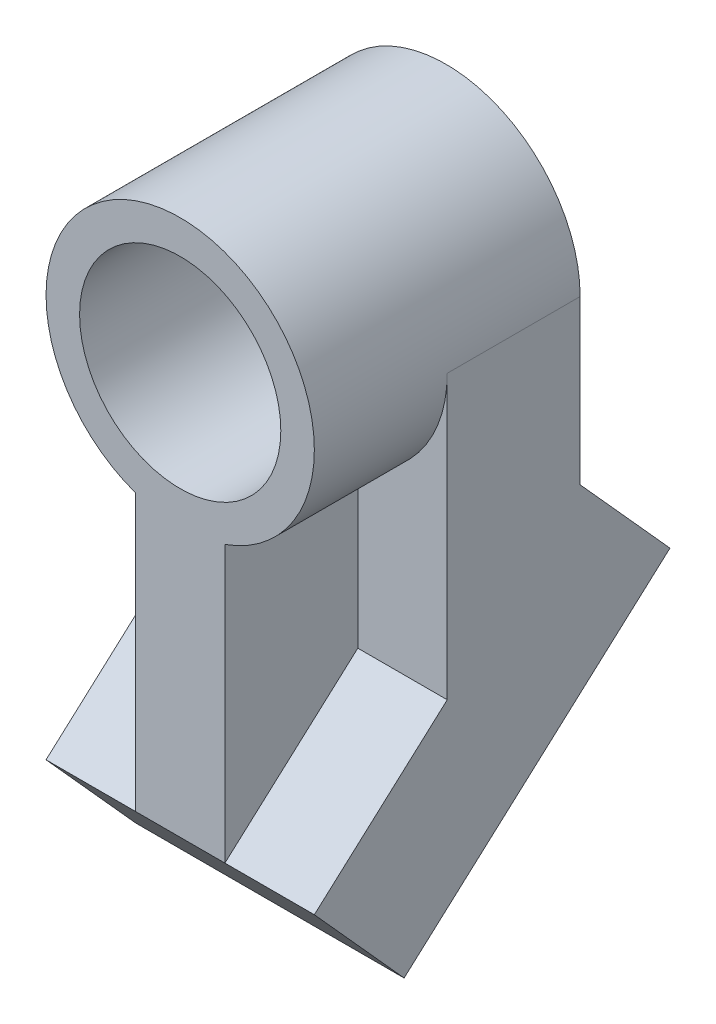
ISO-10303-21;
HEADER;
FILE_DESCRIPTION(('STEP AP214'),'2;1');
FILE_NAME('part.step','',(''),(''),'','','');
FILE_SCHEMA(('AUTOMOTIVE_DESIGN { 1 0 10303 214 1 1 1 1 }'));
ENDSEC;
DATA;
#1=APPLICATION_CONTEXT('core data for automotive mechanical design processes');
#2=APPLICATION_PROTOCOL_DEFINITION('international standard','automotive_design',2000,#1);
#3=PRODUCT_CONTEXT('',#1,'mechanical');
#4=PRODUCT('Part','Part','',(#3));
#5=PRODUCT_RELATED_PRODUCT_CATEGORY('part','',(#4));
#6=PRODUCT_DEFINITION_FORMATION('','',#4);
#7=PRODUCT_DEFINITION_CONTEXT('part definition',#1,'design');
#8=PRODUCT_DEFINITION('design','',#6,#7);
#9=PRODUCT_DEFINITION_SHAPE('','',#8);
#10=(LENGTH_UNIT() NAMED_UNIT(*) SI_UNIT(.MILLI.,.METRE.));
#11=(NAMED_UNIT(*) PLANE_ANGLE_UNIT() SI_UNIT($,.RADIAN.));
#12=(NAMED_UNIT(*) SI_UNIT($,.STERADIAN.) SOLID_ANGLE_UNIT());
#13=UNCERTAINTY_MEASURE_WITH_UNIT(LENGTH_MEASURE(1.E-05),#10,'distance_accuracy_value','');
#14=(GEOMETRIC_REPRESENTATION_CONTEXT(3) GLOBAL_UNCERTAINTY_ASSIGNED_CONTEXT((#13)) GLOBAL_UNIT_ASSIGNED_CONTEXT((#10,
#11,#12)) REPRESENTATION_CONTEXT('',''));
#15=CARTESIAN_POINT('',(0.,0.,0.));
#16=DIRECTION('',(0.,0.,1.));
#17=DIRECTION('',(1.,0.,0.));
#18=AXIS2_PLACEMENT_3D('',#15,#16,#17);
#19=CARTESIAN_POINT('',(-5.,0.,14.86));
#20=DIRECTION('',(-1.,0.,0.));
#21=DIRECTION('',(0.,-1.,0.));
#22=AXIS2_PLACEMENT_3D('',#19,#20,#21);
#23=PLANE('',#22);
#24=DIRECTION('',(0.,1.,0.));
#25=VECTOR('',#24,1.);
#26=CARTESIAN_POINT('',(-5.,0.,0.));
#27=LINE('',#26,#25);
#28=CARTESIAN_POINT('',(-5.,-31.6199959017342,0.));
#29=VERTEX_POINT('',#28);
#30=CARTESIAN_POINT('',(-5.,-14.1421356237309,0.));
#31=VERTEX_POINT('',#30);
#32=EDGE_CURVE('E243',#29,#31,#27,.T.);
#33=ORIENTED_EDGE('',*,*,#32,.F.);
#34=DIRECTION('',(0.,0.669130606358854,-0.743144825477398));
#35=VECTOR('',#34,1.);
#36=CARTESIAN_POINT('',(-4.99999999999999,-45.,14.86));
#37=LINE('',#36,#35);
#38=CARTESIAN_POINT('',(-4.99999999999999,-45.,14.86));
#39=VERTEX_POINT('',#38);
#40=EDGE_CURVE('E196',#39,#29,#37,.T.);
#41=ORIENTED_EDGE('',*,*,#40,.F.);
#42=DIRECTION('',(0.,1.,0.));
#43=VECTOR('',#42,1.);
#44=CARTESIAN_POINT('',(-5.,0.,14.86));
#45=LINE('',#44,#43);
#46=CARTESIAN_POINT('',(-5.,-14.1421356237309,14.86));
#47=VERTEX_POINT('',#46);
#48=EDGE_CURVE('E247',#39,#47,#45,.T.);
#49=ORIENTED_EDGE('',*,*,#48,.T.);
#50=DIRECTION('',(0.,0.,-1.));
#51=VECTOR('',#50,1.);
#52=CARTESIAN_POINT('',(-5.,-14.1421356237309,14.86));
#53=LINE('',#52,#51);
#54=EDGE_CURVE('E253',#47,#31,#53,.T.);
#55=ORIENTED_EDGE('',*,*,#54,.T.);
#56=EDGE_LOOP('',(#33,#41,#49,#55));
#57=FACE_BOUND('',#56,.T.);
#58=ADVANCED_FACE('F39',(#57),#23,.T.);
#59=CARTESIAN_POINT('',(0.,0.,0.));
#60=DIRECTION('',(0.,0.,-1.));
#61=DIRECTION('',(-1.,0.,0.));
#62=AXIS2_PLACEMENT_3D('',#59,#60,#61);
#63=PLANE('',#62);
#64=DIRECTION('',(-1.,0.,0.));
#65=VECTOR('',#64,1.);
#66=CARTESIAN_POINT('',(0.,-31.6199959017342,0.));
#67=LINE('',#66,#65);
#68=CARTESIAN_POINT('',(-15.,-31.6199959017342,0.));
#69=VERTEX_POINT('',#68);
#70=EDGE_CURVE('E217',#29,#69,#67,.T.);
#71=ORIENTED_EDGE('',*,*,#70,.F.);
#72=ORIENTED_EDGE('',*,*,#32,.T.);
#73=CARTESIAN_POINT('',(0.,0.,0.));
#74=DIRECTION('',(0.,0.,1.));
#75=DIRECTION('',(1.,0.,0.));
#76=AXIS2_PLACEMENT_3D('',#73,#74,#75);
#77=CIRCLE('',#76,15.);
#78=CARTESIAN_POINT('',(-15.,0.,0.));
#79=VERTEX_POINT('',#78);
#80=EDGE_CURVE('E255',#79,#31,#77,.T.);
#81=ORIENTED_EDGE('',*,*,#80,.F.);
#82=DIRECTION('',(0.,1.,0.));
#83=VECTOR('',#82,1.);
#84=CARTESIAN_POINT('',(-15.,0.,0.));
#85=LINE('',#84,#83);
#86=EDGE_CURVE('E54',#69,#79,#85,.T.);
#87=ORIENTED_EDGE('',*,*,#86,.F.);
#88=EDGE_LOOP('',(#71,#72,#81,#87));
#89=FACE_BOUND('',#88,.T.);
#90=ADVANCED_FACE('F295',(#89),#63,.F.);
#91=CARTESIAN_POINT('',(0.,0.,-14.86));
#92=DIRECTION('',(0.,0.,-1.));
#93=DIRECTION('',(-1.,0.,0.));
#94=AXIS2_PLACEMENT_3D('',#91,#92,#93);
#95=PLANE('',#94);
#96=DIRECTION('',(0.,-1.,0.));
#97=VECTOR('',#96,1.);
#98=CARTESIAN_POINT('',(15.,0.,-14.86));
#99=LINE('',#98,#97);
#100=CARTESIAN_POINT('',(15.,0.,-14.86));
#101=VERTEX_POINT('',#100);
#102=CARTESIAN_POINT('',(15.,-18.2399918034685,-14.86));
#103=VERTEX_POINT('',#102);
#104=EDGE_CURVE('E224',#101,#103,#99,.T.);
#105=ORIENTED_EDGE('',*,*,#104,.T.);
#106=DIRECTION('',(-1.,0.,0.));
#107=VECTOR('',#106,1.);
#108=CARTESIAN_POINT('',(0.,-18.2399918034685,-14.86));
#109=LINE('',#108,#107);
#110=CARTESIAN_POINT('',(-15.,-18.2399918034685,-14.86));
#111=VERTEX_POINT('',#110);
#112=EDGE_CURVE('E11',#103,#111,#109,.T.);
#113=ORIENTED_EDGE('',*,*,#112,.T.);
#114=DIRECTION('',(0.,1.,0.));
#115=VECTOR('',#114,1.);
#116=CARTESIAN_POINT('',(-15.,0.,-14.86));
#117=LINE('',#116,#115);
#118=CARTESIAN_POINT('',(-15.,0.,-14.86));
#119=VERTEX_POINT('',#118);
#120=EDGE_CURVE('E219',#111,#119,#117,.T.);
#121=ORIENTED_EDGE('',*,*,#120,.T.);
#122=CARTESIAN_POINT('',(0.,0.,-14.86));
#123=DIRECTION('',(0.,0.,-1.));
#124=DIRECTION('',(-1.,0.,0.));
#125=AXIS2_PLACEMENT_3D('',#122,#123,#124);
#126=CIRCLE('',#125,15.);
#127=EDGE_CURVE('E221',#119,#101,#126,.T.);
#128=ORIENTED_EDGE('',*,*,#127,.T.);
#129=EDGE_LOOP('',(#105,#113,#121,#128));
#130=FACE_BOUND('',#129,.T.);
#131=CARTESIAN_POINT('',(0.,0.,-14.86));
#132=DIRECTION('',(0.,0.,-1.));
#133=DIRECTION('',(-1.,0.,0.));
#134=AXIS2_PLACEMENT_3D('',#131,#132,#133);
#135=CIRCLE('',#134,11.25);
#136=CARTESIAN_POINT('',(-11.25,0.,-14.86));
#137=VERTEX_POINT('',#136);
#138=EDGE_CURVE('E227',#137,#137,#135,.F.);
#139=ORIENTED_EDGE('',*,*,#138,.T.);
#140=EDGE_LOOP('',(#139));
#141=FACE_BOUND('',#140,.T.);
#142=ADVANCED_FACE('F278',(#130,#141),#95,.T.);
#143=CARTESIAN_POINT('',(5.,0.,14.86));
#144=DIRECTION('',(-1.,0.,0.));
#145=DIRECTION('',(0.,-1.,0.));
#146=AXIS2_PLACEMENT_3D('',#143,#144,#145);
#147=PLANE('',#146);
#148=DIRECTION('',(0.,1.,0.));
#149=VECTOR('',#148,1.);
#150=CARTESIAN_POINT('',(5.,0.,14.86));
#151=LINE('',#150,#149);
#152=CARTESIAN_POINT('',(5.,-45.,14.86));
#153=VERTEX_POINT('',#152);
#154=CARTESIAN_POINT('',(5.,-14.1421356237309,14.86));
#155=VERTEX_POINT('',#154);
#156=EDGE_CURVE('E242',#153,#155,#151,.T.);
#157=ORIENTED_EDGE('',*,*,#156,.F.);
#158=DIRECTION('',(0.,0.669130606358854,-0.743144825477398));
#159=VECTOR('',#158,1.);
#160=CARTESIAN_POINT('',(5.00000000000001,-24.8518904235224,-7.51674264578613));
#161=LINE('',#160,#159);
#162=CARTESIAN_POINT('',(5.,-31.6199959017342,0.));
#163=VERTEX_POINT('',#162);
#164=EDGE_CURVE('E193',#153,#163,#161,.T.);
#165=ORIENTED_EDGE('',*,*,#164,.T.);
#166=DIRECTION('',(0.,1.,0.));
#167=VECTOR('',#166,1.);
#168=CARTESIAN_POINT('',(5.,0.,0.));
#169=LINE('',#168,#167);
#170=CARTESIAN_POINT('',(5.,-14.1421356237309,0.));
#171=VERTEX_POINT('',#170);
#172=EDGE_CURVE('E238',#163,#171,#169,.T.);
#173=ORIENTED_EDGE('',*,*,#172,.T.);
#174=DIRECTION('',(0.,0.,-1.));
#175=VECTOR('',#174,1.);
#176=CARTESIAN_POINT('',(5.,-14.1421356237309,14.86));
#177=LINE('',#176,#175);
#178=EDGE_CURVE('E47',#155,#171,#177,.T.);
#179=ORIENTED_EDGE('',*,*,#178,.F.);
#180=EDGE_LOOP('',(#157,#165,#173,#179));
#181=FACE_BOUND('',#180,.T.);
#182=ADVANCED_FACE('F41',(#181),#147,.F.);
#183=CARTESIAN_POINT('',(0.,0.,14.86));
#184=DIRECTION('',(0.,0.,-1.));
#185=DIRECTION('',(-1.,0.,0.));
#186=AXIS2_PLACEMENT_3D('',#183,#184,#185);
#187=CYLINDRICAL_SURFACE('',#186,15.);
#188=CARTESIAN_POINT('',(15.,0.,0.));
#189=VERTEX_POINT('',#188);
#190=EDGE_CURVE('E62',#171,#189,#77,.T.);
#191=ORIENTED_EDGE('',*,*,#190,.T.);
#192=DIRECTION('',(0.,0.,1.));
#193=VECTOR('',#192,1.);
#194=CARTESIAN_POINT('',(15.,0.,-14.86));
#195=LINE('',#194,#193);
#196=EDGE_CURVE('E230',#101,#189,#195,.T.);
#197=ORIENTED_EDGE('',*,*,#196,.F.);
#198=ORIENTED_EDGE('',*,*,#127,.F.);
#199=DIRECTION('',(0.,0.,1.));
#200=VECTOR('',#199,1.);
#201=CARTESIAN_POINT('',(-15.,0.,-14.86));
#202=LINE('',#201,#200);
#203=EDGE_CURVE('E235',#119,#79,#202,.T.);
#204=ORIENTED_EDGE('',*,*,#203,.T.);
#205=ORIENTED_EDGE('',*,*,#80,.T.);
#206=ORIENTED_EDGE('',*,*,#54,.F.);
#207=CARTESIAN_POINT('',(0.,0.,14.86));
#208=DIRECTION('',(0.,0.,1.));
#209=DIRECTION('',(1.,0.,0.));
#210=AXIS2_PLACEMENT_3D('',#207,#208,#209);
#211=CIRCLE('',#210,15.);
#212=EDGE_CURVE('E245',#155,#47,#211,.T.);
#213=ORIENTED_EDGE('',*,*,#212,.F.);
#214=ORIENTED_EDGE('',*,*,#178,.T.);
#215=EDGE_LOOP('',(#191,#197,#198,#204,#205,#206,#213,#214));
#216=FACE_BOUND('',#215,.T.);
#217=ADVANCED_FACE('F261',(#216),#187,.T.);
#218=CARTESIAN_POINT('',(0.,0.,14.86));
#219=DIRECTION('',(0.,0.,-1.));
#220=DIRECTION('',(-1.,0.,0.));
#221=AXIS2_PLACEMENT_3D('',#218,#219,#220);
#222=CYLINDRICAL_SURFACE('',#221,11.25);
#223=CARTESIAN_POINT('',(0.,0.,14.86));
#224=DIRECTION('',(0.,0.,1.));
#225=DIRECTION('',(1.,0.,0.));
#226=AXIS2_PLACEMENT_3D('',#223,#224,#225);
#227=CIRCLE('',#226,11.25);
#228=CARTESIAN_POINT('',(11.25,0.,14.86));
#229=VERTEX_POINT('',#228);
#230=EDGE_CURVE('E250',#229,#229,#227,.T.);
#231=ORIENTED_EDGE('',*,*,#230,.T.);
#232=EDGE_LOOP('',(#231));
#233=FACE_BOUND('',#232,.T.);
#234=ORIENTED_EDGE('',*,*,#138,.F.);
#235=EDGE_LOOP('',(#234));
#236=FACE_BOUND('',#235,.T.);
#237=ADVANCED_FACE('F291',(#233,#236),#222,.F.);
#238=CARTESIAN_POINT('',(0.,0.,14.86));
#239=DIRECTION('',(0.,0.,1.));
#240=DIRECTION('',(1.,0.,0.));
#241=AXIS2_PLACEMENT_3D('',#238,#239,#240);
#242=PLANE('',#241);
#243=DIRECTION('',(1.,0.,0.));
#244=VECTOR('',#243,1.);
#245=CARTESIAN_POINT('',(0.,-45.,14.86));
#246=LINE('',#245,#244);
#247=EDGE_CURVE('E239',#39,#153,#246,.T.);
#248=ORIENTED_EDGE('',*,*,#247,.T.);
#249=ORIENTED_EDGE('',*,*,#156,.T.);
#250=ORIENTED_EDGE('',*,*,#212,.T.);
#251=ORIENTED_EDGE('',*,*,#48,.F.);
#252=EDGE_LOOP('',(#248,#249,#250,#251));
#253=FACE_BOUND('',#252,.T.);
#254=ORIENTED_EDGE('',*,*,#230,.F.);
#255=EDGE_LOOP('',(#254));
#256=FACE_BOUND('',#255,.T.);
#257=ADVANCED_FACE('F284',(#253,#256),#242,.T.);
#258=CARTESIAN_POINT('',(-15.,0.,-14.86));
#259=DIRECTION('',(1.,0.,0.));
#260=DIRECTION('',(0.,1.,0.));
#261=AXIS2_PLACEMENT_3D('',#258,#259,#260);
#262=PLANE('',#261);
#263=DIRECTION('',(0.,0.669130606358854,-0.743144825477398));
#264=VECTOR('',#263,1.);
#265=CARTESIAN_POINT('',(-15.,-45.,14.86));
#266=LINE('',#265,#264);
#267=CARTESIAN_POINT('',(-15.,-45.,14.86));
#268=VERTEX_POINT('',#267);
#269=EDGE_CURVE('E203',#268,#69,#266,.T.);
#270=ORIENTED_EDGE('',*,*,#269,.T.);
#271=ORIENTED_EDGE('',*,*,#86,.T.);
#272=ORIENTED_EDGE('',*,*,#203,.F.);
#273=ORIENTED_EDGE('',*,*,#120,.F.);
#274=CARTESIAN_POINT('',(-15.,-18.2347757456458,-14.8657930190959));
#275=VERTEX_POINT('',#274);
#276=EDGE_CURVE('E202',#111,#275,#266,.T.);
#277=ORIENTED_EDGE('',*,*,#276,.T.);
#278=DIRECTION('',(0.,-0.743144825477396,-0.669130606358856));
#279=VECTOR('',#278,1.);
#280=CARTESIAN_POINT('',(-15.,-18.2347757456458,-14.8657930190959));
#281=LINE('',#280,#279);
#282=CARTESIAN_POINT('',(-15.,-29.3819481278068,-24.9027521144788));
#283=VERTEX_POINT('',#282);
#284=EDGE_CURVE('E205',#275,#283,#281,.T.);
#285=ORIENTED_EDGE('',*,*,#284,.T.);
#286=DIRECTION('',(0.,-0.669130606358856,0.743144825477396));
#287=VECTOR('',#286,1.);
#288=CARTESIAN_POINT('',(-15.,-29.3819481278068,-24.9027521144788));
#289=LINE('',#288,#287);
#290=CARTESIAN_POINT('',(-15.,-56.147172382161,4.82304090461707));
#291=VERTEX_POINT('',#290);
#292=EDGE_CURVE('E197',#283,#291,#289,.T.);
#293=ORIENTED_EDGE('',*,*,#292,.T.);
#294=DIRECTION('',(0.,0.743144825477396,0.669130606358856));
#295=VECTOR('',#294,1.);
#296=CARTESIAN_POINT('',(-15.,-56.147172382161,4.82304090461707));
#297=LINE('',#296,#295);
#298=EDGE_CURVE('E200',#291,#268,#297,.T.);
#299=ORIENTED_EDGE('',*,*,#298,.T.);
#300=EDGE_LOOP('',(#270,#271,#272,#273,#277,#285,#293,#299));
#301=FACE_BOUND('',#300,.T.);
#302=ADVANCED_FACE('F281',(#301),#262,.F.);
#303=CARTESIAN_POINT('',(15.,0.,-14.86));
#304=DIRECTION('',(-1.,0.,0.));
#305=DIRECTION('',(0.,-1.,0.));
#306=AXIS2_PLACEMENT_3D('',#303,#304,#305);
#307=PLANE('',#306);
#308=DIRECTION('',(0.,0.669130606358854,-0.743144825477398));
#309=VECTOR('',#308,1.);
#310=CARTESIAN_POINT('',(15.,-45.,14.86));
#311=LINE('',#310,#309);
#312=CARTESIAN_POINT('',(15.,-18.2347757456458,-14.8657930190959));
#313=VERTEX_POINT('',#312);
#314=EDGE_CURVE('E181',#103,#313,#311,.T.);
#315=ORIENTED_EDGE('',*,*,#314,.F.);
#316=ORIENTED_EDGE('',*,*,#104,.F.);
#317=ORIENTED_EDGE('',*,*,#196,.T.);
#318=DIRECTION('',(0.,-1.,0.));
#319=VECTOR('',#318,1.);
#320=CARTESIAN_POINT('',(15.,0.,0.));
#321=LINE('',#320,#319);
#322=CARTESIAN_POINT('',(15.,-31.6199959017342,0.));
#323=VERTEX_POINT('',#322);
#324=EDGE_CURVE('E222',#189,#323,#321,.T.);
#325=ORIENTED_EDGE('',*,*,#324,.T.);
#326=CARTESIAN_POINT('',(15.,-45.,14.86));
#327=VERTEX_POINT('',#326);
#328=EDGE_CURVE('E182',#327,#323,#311,.T.);
#329=ORIENTED_EDGE('',*,*,#328,.F.);
#330=DIRECTION('',(0.,0.743144825477396,0.669130606358856));
#331=VECTOR('',#330,1.);
#332=CARTESIAN_POINT('',(15.,-56.147172382161,4.82304090461707));
#333=LINE('',#332,#331);
#334=CARTESIAN_POINT('',(15.,-56.147172382161,4.82304090461707));
#335=VERTEX_POINT('',#334);
#336=EDGE_CURVE('E178',#335,#327,#333,.T.);
#337=ORIENTED_EDGE('',*,*,#336,.F.);
#338=DIRECTION('',(0.,-0.669130606358856,0.743144825477396));
#339=VECTOR('',#338,1.);
#340=CARTESIAN_POINT('',(15.,-29.3819481278067,-24.9027521144788));
#341=LINE('',#340,#339);
#342=CARTESIAN_POINT('',(15.,-29.3819481278067,-24.9027521144788));
#343=VERTEX_POINT('',#342);
#344=EDGE_CURVE('E175',#343,#335,#341,.T.);
#345=ORIENTED_EDGE('',*,*,#344,.F.);
#346=DIRECTION('',(0.,-0.743144825477396,-0.669130606358856));
#347=VECTOR('',#346,1.);
#348=CARTESIAN_POINT('',(15.,-18.2347757456458,-14.8657930190959));
#349=LINE('',#348,#347);
#350=EDGE_CURVE('E184',#313,#343,#349,.T.);
#351=ORIENTED_EDGE('',*,*,#350,.F.);
#352=EDGE_LOOP('',(#315,#316,#317,#325,#329,#337,#345,#351));
#353=FACE_BOUND('',#352,.T.);
#354=ADVANCED_FACE('F272',(#353),#307,.F.);
#355=ORIENTED_EDGE('',*,*,#172,.F.);
#356=DIRECTION('',(1.,0.,0.));
#357=VECTOR('',#356,1.);
#358=CARTESIAN_POINT('',(0.,-31.6199959017342,0.));
#359=LINE('',#358,#357);
#360=EDGE_CURVE('E190',#163,#323,#359,.T.);
#361=ORIENTED_EDGE('',*,*,#360,.T.);
#362=ORIENTED_EDGE('',*,*,#324,.F.);
#363=ORIENTED_EDGE('',*,*,#190,.F.);
#364=EDGE_LOOP('',(#355,#361,#362,#363));
#365=FACE_BOUND('',#364,.T.);
#366=ADVANCED_FACE('F268',(#365),#63,.F.);
#367=CARTESIAN_POINT('',(-15.,-45.,14.86));
#368=DIRECTION('',(0.,-0.743144825477398,-0.669130606358854));
#369=DIRECTION('',(0.,0.669130606358854,-0.743144825477398));
#370=AXIS2_PLACEMENT_3D('',#367,#368,#369);
#371=PLANE('',#370);
#372=ORIENTED_EDGE('',*,*,#40,.T.);
#373=ORIENTED_EDGE('',*,*,#70,.T.);
#374=ORIENTED_EDGE('',*,*,#269,.F.);
#375=DIRECTION('',(1.,0.,0.));
#376=VECTOR('',#375,1.);
#377=CARTESIAN_POINT('',(-15.,-45.,14.86));
#378=LINE('',#377,#376);
#379=EDGE_CURVE('E212',#268,#39,#378,.T.);
#380=ORIENTED_EDGE('',*,*,#379,.T.);
#381=EDGE_LOOP('',(#372,#373,#374,#380));
#382=FACE_BOUND('',#381,.T.);
#383=ADVANCED_FACE('F322',(#382),#371,.F.);
#384=CARTESIAN_POINT('',(-15.,-29.3819481278068,-24.9027521144788));
#385=DIRECTION('',(0.,0.743144825477396,0.669130606358857));
#386=DIRECTION('',(0.,-0.669130606358857,0.743144825477396));
#387=AXIS2_PLACEMENT_3D('',#384,#385,#386);
#388=PLANE('',#387);
#389=CARTESIAN_POINT('',(-10.,-49.4558663185724,-2.60840735015689));
#390=DIRECTION('',(0.,-0.743144825477396,-0.669130606358857));
#391=DIRECTION('',(0.,0.669130606358857,-0.743144825477396));
#392=AXIS2_PLACEMENT_3D('',#389,#390,#391);
#393=CIRCLE('',#392,1.44999999999999);
#394=CARTESIAN_POINT('',(-10.,-48.4856269393521,-3.6859673470991));
#395=VERTEX_POINT('',#394);
#396=EDGE_CURVE('E153',#395,#395,#393,.T.);
#397=ORIENTED_EDGE('',*,*,#396,.F.);
#398=EDGE_LOOP('',(#397));
#399=FACE_BOUND('',#398,.T.);
#400=CARTESIAN_POINT('',(10.,-49.4558663185725,-2.60840735015678));
#401=DIRECTION('',(0.,-0.743144825477396,-0.669130606358857));
#402=DIRECTION('',(0.,0.669130606358857,-0.743144825477396));
#403=AXIS2_PLACEMENT_3D('',#400,#401,#402);
#404=CIRCLE('',#403,1.44999999999999);
#405=CARTESIAN_POINT('',(10.,-48.4856269393522,-3.685967347099));
#406=VERTEX_POINT('',#405);
#407=EDGE_CURVE('E152',#406,#406,#404,.T.);
#408=ORIENTED_EDGE('',*,*,#407,.F.);
#409=EDGE_LOOP('',(#408));
#410=FACE_BOUND('',#409,.T.);
#411=CARTESIAN_POINT('',(10.0000000000001,-36.0732541913954,-17.4713038597047));
#412=DIRECTION('',(0.,-0.743144825477396,-0.669130606358857));
#413=DIRECTION('',(0.,0.669130606358857,-0.743144825477396));
#414=AXIS2_PLACEMENT_3D('',#411,#412,#413);
#415=CIRCLE('',#414,1.44999999999999);
#416=CARTESIAN_POINT('',(10.0000000000001,-35.1030148121751,-18.5488638566469));
#417=VERTEX_POINT('',#416);
#418=EDGE_CURVE('E163',#417,#417,#415,.T.);
#419=ORIENTED_EDGE('',*,*,#418,.F.);
#420=EDGE_LOOP('',(#419));
#421=FACE_BOUND('',#420,.T.);
#422=CARTESIAN_POINT('',(-9.99999999999993,-36.0732541913953,-17.4713038597048));
#423=DIRECTION('',(0.,-0.743144825477396,-0.669130606358857));
#424=DIRECTION('',(0.,0.669130606358857,-0.743144825477396));
#425=AXIS2_PLACEMENT_3D('',#422,#423,#424);
#426=CIRCLE('',#425,1.44999999999999);
#427=CARTESIAN_POINT('',(-9.99999999999993,-35.103014812175,-18.548863856647));
#428=VERTEX_POINT('',#427);
#429=EDGE_CURVE('E169',#428,#428,#426,.T.);
#430=ORIENTED_EDGE('',*,*,#429,.F.);
#431=EDGE_LOOP('',(#430));
#432=FACE_BOUND('',#431,.T.);
#433=DIRECTION('',(1.,0.,0.));
#434=VECTOR('',#433,1.);
#435=CARTESIAN_POINT('',(-15.,-29.3819481278068,-24.9027521144788));
#436=LINE('',#435,#434);
#437=EDGE_CURVE('E207',#283,#343,#436,.T.);
#438=ORIENTED_EDGE('',*,*,#437,.T.);
#439=ORIENTED_EDGE('',*,*,#344,.T.);
#440=DIRECTION('',(1.,0.,0.));
#441=VECTOR('',#440,1.);
#442=CARTESIAN_POINT('',(-15.,-56.147172382161,4.82304090461707));
#443=LINE('',#442,#441);
#444=EDGE_CURVE('E215',#291,#335,#443,.T.);
#445=ORIENTED_EDGE('',*,*,#444,.F.);
#446=ORIENTED_EDGE('',*,*,#292,.F.);
#447=EDGE_LOOP('',(#438,#439,#445,#446));
#448=FACE_BOUND('',#447,.T.);
#449=ADVANCED_FACE('F325',(#399,#410,#421,#432,#448),#388,.F.);
#450=CARTESIAN_POINT('',(-15.,-56.147172382161,4.82304090461707));
#451=DIRECTION('',(0.,0.669130606358856,-0.743144825477396));
#452=DIRECTION('',(0.,0.743144825477396,0.669130606358857));
#453=AXIS2_PLACEMENT_3D('',#450,#451,#452);
#454=PLANE('',#453);
#455=ORIENTED_EDGE('',*,*,#444,.T.);
#456=ORIENTED_EDGE('',*,*,#336,.T.);
#457=DIRECTION('',(-1.,0.,0.));
#458=VECTOR('',#457,1.);
#459=CARTESIAN_POINT('',(15.,-45.,14.86));
#460=LINE('',#459,#458);
#461=EDGE_CURVE('E187',#327,#153,#460,.T.);
#462=ORIENTED_EDGE('',*,*,#461,.T.);
#463=ORIENTED_EDGE('',*,*,#247,.F.);
#464=ORIENTED_EDGE('',*,*,#379,.F.);
#465=ORIENTED_EDGE('',*,*,#298,.F.);
#466=EDGE_LOOP('',(#455,#456,#462,#463,#464,#465));
#467=FACE_BOUND('',#466,.T.);
#468=ADVANCED_FACE('F319',(#467),#454,.F.);
#469=ORIENTED_EDGE('',*,*,#112,.F.);
#470=ORIENTED_EDGE('',*,*,#314,.T.);
#471=DIRECTION('',(1.,0.,0.));
#472=VECTOR('',#471,1.);
#473=CARTESIAN_POINT('',(-15.,-18.2347757456458,-14.8657930190959));
#474=LINE('',#473,#472);
#475=EDGE_CURVE('E210',#275,#313,#474,.T.);
#476=ORIENTED_EDGE('',*,*,#475,.F.);
#477=ORIENTED_EDGE('',*,*,#276,.F.);
#478=EDGE_LOOP('',(#469,#470,#476,#477));
#479=FACE_BOUND('',#478,.T.);
#480=ADVANCED_FACE('F327',(#479),#371,.F.);
#481=CARTESIAN_POINT('',(-15.,-18.2347757456458,-14.8657930190959));
#482=DIRECTION('',(0.,-0.669130606358856,0.743144825477396));
#483=DIRECTION('',(0.,-0.743144825477396,-0.669130606358856));
#484=AXIS2_PLACEMENT_3D('',#481,#482,#483);
#485=PLANE('',#484);
#486=ORIENTED_EDGE('',*,*,#475,.T.);
#487=ORIENTED_EDGE('',*,*,#350,.T.);
#488=ORIENTED_EDGE('',*,*,#437,.F.);
#489=ORIENTED_EDGE('',*,*,#284,.F.);
#490=EDGE_LOOP('',(#486,#487,#488,#489));
#491=FACE_BOUND('',#490,.T.);
#492=ADVANCED_FACE('F337',(#491),#485,.F.);
#493=CARTESIAN_POINT('',(15.,-45.,14.86));
#494=DIRECTION('',(0.,0.743144825477398,0.669130606358854));
#495=DIRECTION('',(0.,-0.669130606358854,0.743144825477398));
#496=AXIS2_PLACEMENT_3D('',#493,#494,#495);
#497=PLANE('',#496);
#498=ORIENTED_EDGE('',*,*,#164,.F.);
#499=ORIENTED_EDGE('',*,*,#461,.F.);
#500=ORIENTED_EDGE('',*,*,#328,.T.);
#501=ORIENTED_EDGE('',*,*,#360,.F.);
#502=EDGE_LOOP('',(#498,#499,#500,#501));
#503=FACE_BOUND('',#502,.T.);
#504=ADVANCED_FACE('F343',(#503),#497,.T.);
#505=CARTESIAN_POINT('',(-9.99999999999993,-28.6418059366214,-10.7799977961162));
#506=DIRECTION('',(0.,-0.743144825477396,-0.669130606358857));
#507=DIRECTION('',(0.,0.669130606358857,-0.743144825477396));
#508=AXIS2_PLACEMENT_3D('',#505,#506,#507);
#509=CONICAL_SURFACE('',#508,1.44999999999999,1.02974425867665);
#510=CARTESIAN_POINT('',(-9.99999999999993,-27.9943425698193,-10.197019162113));
#511=VERTEX_POINT('',#510);
#512=VERTEX_LOOP('',#511);
#513=FACE_BOUND('',#512,.T.);
#514=CARTESIAN_POINT('',(-9.99999999999993,-28.6418059366214,-10.7799977961162));
#515=DIRECTION('',(0.,-0.743144825477396,-0.669130606358857));
#516=DIRECTION('',(0.,0.669130606358857,-0.743144825477396));
#517=AXIS2_PLACEMENT_3D('',#514,#515,#516);
#518=CIRCLE('',#517,1.44999999999999);
#519=CARTESIAN_POINT('',(-9.99999999999993,-27.671566557401,-11.8575577930585));
#520=VERTEX_POINT('',#519);
#521=EDGE_CURVE('E172',#520,#520,#518,.T.);
#522=ORIENTED_EDGE('',*,*,#521,.T.);
#523=EDGE_LOOP('',(#522));
#524=FACE_BOUND('',#523,.T.);
#525=ADVANCED_FACE('F372',(#513,#524),#509,.F.);
#526=CARTESIAN_POINT('',(-9.99999999999993,-36.0732541913953,-17.4713038597048));
#527=DIRECTION('',(0.,-0.743144825477396,-0.669130606358857));
#528=DIRECTION('',(0.,0.669130606358857,-0.743144825477396));
#529=AXIS2_PLACEMENT_3D('',#526,#527,#528);
#530=CYLINDRICAL_SURFACE('',#529,1.44999999999999);
#531=ORIENTED_EDGE('',*,*,#521,.F.);
#532=EDGE_LOOP('',(#531));
#533=FACE_BOUND('',#532,.T.);
#534=ORIENTED_EDGE('',*,*,#429,.T.);
#535=EDGE_LOOP('',(#534));
#536=FACE_BOUND('',#535,.T.);
#537=ADVANCED_FACE('F377',(#533,#536),#530,.F.);
#538=CARTESIAN_POINT('',(10.0000000000001,-28.6418059366215,-10.7799977961161));
#539=DIRECTION('',(0.,-0.743144825477396,-0.669130606358857));
#540=DIRECTION('',(0.,0.669130606358857,-0.743144825477396));
#541=AXIS2_PLACEMENT_3D('',#538,#539,#540);
#542=CONICAL_SURFACE('',#541,1.44999999999999,1.02974425867665);
#543=CARTESIAN_POINT('',(10.0000000000001,-27.9943425698194,-10.1970191621129));
#544=VERTEX_POINT('',#543);
#545=VERTEX_LOOP('',#544);
#546=FACE_BOUND('',#545,.T.);
#547=CARTESIAN_POINT('',(10.0000000000001,-28.6418059366215,-10.7799977961161));
#548=DIRECTION('',(0.,-0.743144825477396,-0.669130606358857));
#549=DIRECTION('',(0.,0.669130606358857,-0.743144825477396));
#550=AXIS2_PLACEMENT_3D('',#547,#548,#549);
#551=CIRCLE('',#550,1.44999999999999);
#552=CARTESIAN_POINT('',(10.0000000000001,-27.6715665574011,-11.8575577930583));
#553=VERTEX_POINT('',#552);
#554=EDGE_CURVE('E166',#553,#553,#551,.T.);
#555=ORIENTED_EDGE('',*,*,#554,.T.);
#556=EDGE_LOOP('',(#555));
#557=FACE_BOUND('',#556,.T.);
#558=ADVANCED_FACE('F388',(#546,#557),#542,.F.);
#559=CARTESIAN_POINT('',(10.0000000000001,-36.0732541913954,-17.4713038597047));
#560=DIRECTION('',(0.,-0.743144825477396,-0.669130606358857));
#561=DIRECTION('',(0.,0.669130606358857,-0.743144825477396));
#562=AXIS2_PLACEMENT_3D('',#559,#560,#561);
#563=CYLINDRICAL_SURFACE('',#562,1.44999999999999);
#564=ORIENTED_EDGE('',*,*,#554,.F.);
#565=EDGE_LOOP('',(#564));
#566=FACE_BOUND('',#565,.T.);
#567=ORIENTED_EDGE('',*,*,#418,.T.);
#568=EDGE_LOOP('',(#567));
#569=FACE_BOUND('',#568,.T.);
#570=ADVANCED_FACE('F400',(#566,#569),#563,.F.);
#571=CARTESIAN_POINT('',(10.,-42.0244180637986,4.08289871343178));
#572=DIRECTION('',(0.,-0.743144825477396,-0.669130606358857));
#573=DIRECTION('',(0.,0.669130606358857,-0.743144825477396));
#574=AXIS2_PLACEMENT_3D('',#571,#572,#573);
#575=CONICAL_SURFACE('',#574,1.44999999999999,1.02974425867665);
#576=CARTESIAN_POINT('',(10.,-41.3769546969965,4.66587734743503));
#577=VERTEX_POINT('',#576);
#578=VERTEX_LOOP('',#577);
#579=FACE_BOUND('',#578,.T.);
#580=CARTESIAN_POINT('',(10.,-42.0244180637986,4.08289871343178));
#581=DIRECTION('',(0.,-0.743144825477396,-0.669130606358857));
#582=DIRECTION('',(0.,0.669130606358857,-0.743144825477396));
#583=AXIS2_PLACEMENT_3D('',#580,#581,#582);
#584=CIRCLE('',#583,1.44999999999999);
#585=CARTESIAN_POINT('',(10.,-41.0541786845783,3.00533871648957));
#586=VERTEX_POINT('',#585);
#587=EDGE_CURVE('E156',#586,#586,#584,.T.);
#588=ORIENTED_EDGE('',*,*,#587,.T.);
#589=EDGE_LOOP('',(#588));
#590=FACE_BOUND('',#589,.T.);
#591=ADVANCED_FACE('F410',(#579,#590),#575,.F.);
#592=CARTESIAN_POINT('',(10.,-49.4558663185725,-2.60840735015678));
#593=DIRECTION('',(0.,-0.743144825477396,-0.669130606358857));
#594=DIRECTION('',(0.,0.669130606358857,-0.743144825477396));
#595=AXIS2_PLACEMENT_3D('',#592,#593,#594);
#596=CYLINDRICAL_SURFACE('',#595,1.44999999999999);
#597=ORIENTED_EDGE('',*,*,#587,.F.);
#598=EDGE_LOOP('',(#597));
#599=FACE_BOUND('',#598,.T.);
#600=ORIENTED_EDGE('',*,*,#407,.T.);
#601=EDGE_LOOP('',(#600));
#602=FACE_BOUND('',#601,.T.);
#603=ADVANCED_FACE('F146',(#599,#602),#596,.F.);
#604=CARTESIAN_POINT('',(-10.,-42.0244180637985,4.08289871343168));
#605=DIRECTION('',(0.,-0.743144825477396,-0.669130606358857));
#606=DIRECTION('',(0.,0.669130606358857,-0.743144825477396));
#607=AXIS2_PLACEMENT_3D('',#604,#605,#606);
#608=CONICAL_SURFACE('',#607,1.44999999999999,1.02974425867665);
#609=CARTESIAN_POINT('',(-10.,-41.3769546969964,4.66587734743493));
#610=VERTEX_POINT('',#609);
#611=VERTEX_LOOP('',#610);
#612=FACE_BOUND('',#611,.T.);
#613=CARTESIAN_POINT('',(-10.,-42.0244180637985,4.08289871343168));
#614=DIRECTION('',(0.,-0.743144825477396,-0.669130606358857));
#615=DIRECTION('',(0.,0.669130606358857,-0.743144825477396));
#616=AXIS2_PLACEMENT_3D('',#613,#614,#615);
#617=CIRCLE('',#616,1.44999999999999);
#618=CARTESIAN_POINT('',(-10.,-41.0541786845782,3.00533871648946));
#619=VERTEX_POINT('',#618);
#620=EDGE_CURVE('E150',#619,#619,#617,.T.);
#621=ORIENTED_EDGE('',*,*,#620,.T.);
#622=EDGE_LOOP('',(#621));
#623=FACE_BOUND('',#622,.T.);
#624=ADVANCED_FACE('F142',(#612,#623),#608,.F.);
#625=CARTESIAN_POINT('',(-10.,-49.4558663185724,-2.60840735015689));
#626=DIRECTION('',(0.,-0.743144825477396,-0.669130606358857));
#627=DIRECTION('',(0.,0.669130606358857,-0.743144825477396));
#628=AXIS2_PLACEMENT_3D('',#625,#626,#627);
#629=CYLINDRICAL_SURFACE('',#628,1.44999999999999);
#630=ORIENTED_EDGE('',*,*,#620,.F.);
#631=EDGE_LOOP('',(#630));
#632=FACE_BOUND('',#631,.T.);
#633=ORIENTED_EDGE('',*,*,#396,.T.);
#634=EDGE_LOOP('',(#633));
#635=FACE_BOUND('',#634,.T.);
#636=ADVANCED_FACE('F145',(#632,#635),#629,.F.);
#637=CLOSED_SHELL('',(#58,#90,#142,#182,#217,#237,#257,#302,#354,#366,#383,#449,#468,#480,#492,
#504,#525,#537,#558,#570,#591,#603,#624,#636));
#638=MANIFOLD_SOLID_BREP('B2',#637);
#639=ADVANCED_BREP_SHAPE_REPRESENTATION('',(#18,#638),#14);
#640=SHAPE_DEFINITION_REPRESENTATION(#9,#639);
ENDSEC;
END-ISO-10303-21;
